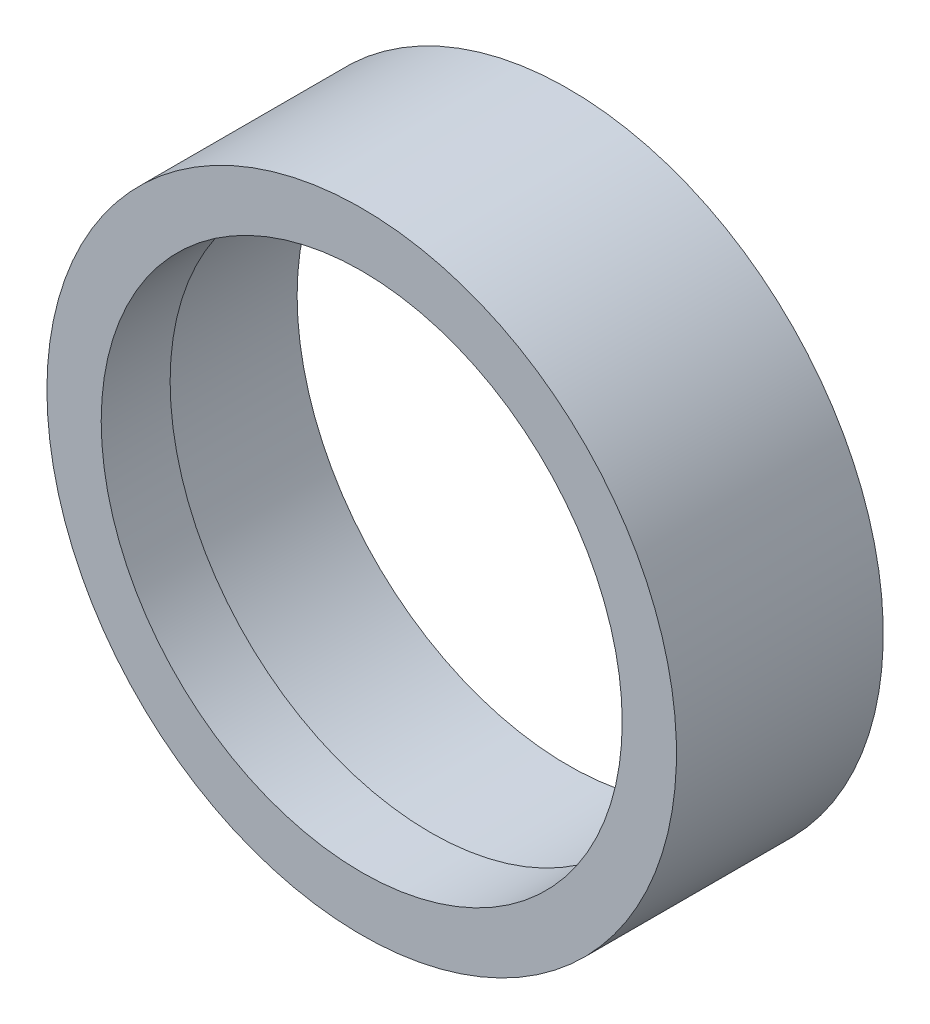
ISO-10303-21;
HEADER;
FILE_DESCRIPTION(('STEP AP214'),'2;1');
FILE_NAME('part.step','',(''),(''),'','','');
FILE_SCHEMA(('AUTOMOTIVE_DESIGN { 1 0 10303 214 1 1 1 1 }'));
ENDSEC;
DATA;
#1=APPLICATION_CONTEXT('core data for automotive mechanical design processes');
#2=APPLICATION_PROTOCOL_DEFINITION('international standard','automotive_design',2000,#1);
#3=PRODUCT_CONTEXT('',#1,'mechanical');
#4=PRODUCT('Part','Part','',(#3));
#5=PRODUCT_RELATED_PRODUCT_CATEGORY('part','',(#4));
#6=PRODUCT_DEFINITION_FORMATION('','',#4);
#7=PRODUCT_DEFINITION_CONTEXT('part definition',#1,'design');
#8=PRODUCT_DEFINITION('design','',#6,#7);
#9=PRODUCT_DEFINITION_SHAPE('','',#8);
#10=(LENGTH_UNIT() NAMED_UNIT(*) SI_UNIT(.MILLI.,.METRE.));
#11=(NAMED_UNIT(*) PLANE_ANGLE_UNIT() SI_UNIT($,.RADIAN.));
#12=(NAMED_UNIT(*) SI_UNIT($,.STERADIAN.) SOLID_ANGLE_UNIT());
#13=UNCERTAINTY_MEASURE_WITH_UNIT(LENGTH_MEASURE(1.E-05),#10,'distance_accuracy_value','');
#14=(GEOMETRIC_REPRESENTATION_CONTEXT(3) GLOBAL_UNCERTAINTY_ASSIGNED_CONTEXT((#13)) GLOBAL_UNIT_ASSIGNED_CONTEXT((#10,
#11,#12)) REPRESENTATION_CONTEXT('',''));
#15=CARTESIAN_POINT('',(0.,0.,0.));
#16=DIRECTION('',(0.,0.,1.));
#17=DIRECTION('',(1.,0.,0.));
#18=AXIS2_PLACEMENT_3D('',#15,#16,#17);
#19=CARTESIAN_POINT('',(0.,0.,19.05));
#20=DIRECTION('',(0.,0.,-1.));
#21=DIRECTION('',(-1.,0.,0.));
#22=AXIS2_PLACEMENT_3D('',#19,#20,#21);
#23=CYLINDRICAL_SURFACE('',#22,25.);
#24=CARTESIAN_POINT('',(0.,0.,0.));
#25=DIRECTION('',(0.,0.,1.));
#26=DIRECTION('',(1.,0.,0.));
#27=AXIS2_PLACEMENT_3D('',#24,#25,#26);
#28=CIRCLE('',#27,25.);
#29=CARTESIAN_POINT('',(-25.,0.,0.));
#30=VERTEX_POINT('',#29);
#31=EDGE_CURVE('E44',#30,#30,#28,.T.);
#32=CARTESIAN_POINT('',(0.,0.,12.7));
#33=DIRECTION('',(0.,0.,1.));
#34=DIRECTION('',(1.,0.,0.));
#35=AXIS2_PLACEMENT_3D('',#32,#33,#34);
#36=CIRCLE('',#35,25.);
#37=CARTESIAN_POINT('',(-25.,0.,12.7));
#38=VERTEX_POINT('',#37);
#39=EDGE_CURVE('E48',#38,#38,#36,.T.);
#40=CARTESIAN_POINT('',(-25.,0.,0.));
#41=CARTESIAN_POINT('',(-25.,0.,0.132291666666667));
#42=CARTESIAN_POINT('',(-25.,0.,0.264583333333334));
#43=CARTESIAN_POINT('',(-25.,0.,0.529166666666667));
#44=CARTESIAN_POINT('',(-25.,0.,0.661458333333333));
#45=CARTESIAN_POINT('',(-25.,0.,0.926041666666666));
#46=CARTESIAN_POINT('',(-25.,0.,1.05833333333333));
#47=CARTESIAN_POINT('',(-25.,0.,1.32291666666667));
#48=CARTESIAN_POINT('',(-25.,0.,1.45520833333333));
#49=CARTESIAN_POINT('',(-25.,0.,1.71979166666667));
#50=CARTESIAN_POINT('',(-25.,0.,1.85208333333333));
#51=CARTESIAN_POINT('',(-25.,0.,2.11666666666667));
#52=CARTESIAN_POINT('',(-25.,0.,2.24895833333333));
#53=CARTESIAN_POINT('',(-25.,0.,2.51354166666667));
#54=CARTESIAN_POINT('',(-25.,0.,2.64583333333333));
#55=CARTESIAN_POINT('',(-25.,0.,2.91041666666667));
#56=CARTESIAN_POINT('',(-25.,0.,3.04270833333333));
#57=CARTESIAN_POINT('',(-25.,0.,3.30729166666667));
#58=CARTESIAN_POINT('',(-25.,0.,3.43958333333333));
#59=CARTESIAN_POINT('',(-25.,0.,3.70416666666667));
#60=CARTESIAN_POINT('',(-25.,0.,3.83645833333333));
#61=CARTESIAN_POINT('',(-25.,0.,4.10104166666667));
#62=CARTESIAN_POINT('',(-25.,0.,4.23333333333333));
#63=CARTESIAN_POINT('',(-25.,0.,4.49791666666667));
#64=CARTESIAN_POINT('',(-25.,0.,4.63020833333333));
#65=CARTESIAN_POINT('',(-25.,0.,4.89479166666667));
#66=CARTESIAN_POINT('',(-25.,0.,5.02708333333333));
#67=CARTESIAN_POINT('',(-25.,0.,5.29166666666667));
#68=CARTESIAN_POINT('',(-25.,0.,5.42395833333333));
#69=CARTESIAN_POINT('',(-25.,0.,5.68854166666667));
#70=CARTESIAN_POINT('',(-25.,0.,5.82083333333333));
#71=CARTESIAN_POINT('',(-25.,0.,6.08541666666667));
#72=CARTESIAN_POINT('',(-25.,0.,6.21770833333333));
#73=CARTESIAN_POINT('',(-25.,0.,6.48229166666667));
#74=CARTESIAN_POINT('',(-25.,0.,6.61458333333333));
#75=CARTESIAN_POINT('',(-25.,0.,6.87916666666667));
#76=CARTESIAN_POINT('',(-25.,0.,7.01145833333333));
#77=CARTESIAN_POINT('',(-25.,0.,7.27604166666667));
#78=CARTESIAN_POINT('',(-25.,0.,7.40833333333333));
#79=CARTESIAN_POINT('',(-25.,0.,7.67291666666667));
#80=CARTESIAN_POINT('',(-25.,0.,7.80520833333333));
#81=CARTESIAN_POINT('',(-25.,0.,8.06979166666667));
#82=CARTESIAN_POINT('',(-25.,0.,8.20208333333333));
#83=CARTESIAN_POINT('',(-25.,0.,8.46666666666667));
#84=CARTESIAN_POINT('',(-25.,0.,8.59895833333333));
#85=CARTESIAN_POINT('',(-25.,0.,8.86354166666667));
#86=CARTESIAN_POINT('',(-25.,0.,8.99583333333334));
#87=CARTESIAN_POINT('',(-25.,0.,9.26041666666667));
#88=CARTESIAN_POINT('',(-25.,0.,9.39270833333333));
#89=CARTESIAN_POINT('',(-25.,0.,9.65729166666667));
#90=CARTESIAN_POINT('',(-25.,0.,9.78958333333333));
#91=CARTESIAN_POINT('',(-25.,0.,10.0541666666667));
#92=CARTESIAN_POINT('',(-25.,0.,10.1864583333333));
#93=CARTESIAN_POINT('',(-25.,0.,10.4510416666667));
#94=CARTESIAN_POINT('',(-25.,0.,10.5833333333333));
#95=CARTESIAN_POINT('',(-25.,0.,10.8479166666667));
#96=CARTESIAN_POINT('',(-25.,0.,10.9802083333333));
#97=CARTESIAN_POINT('',(-25.,0.,11.2447916666667));
#98=CARTESIAN_POINT('',(-25.,0.,11.3770833333333));
#99=CARTESIAN_POINT('',(-25.,0.,11.6416666666667));
#100=CARTESIAN_POINT('',(-25.,0.,11.7739583333333));
#101=CARTESIAN_POINT('',(-25.,0.,12.0385416666667));
#102=CARTESIAN_POINT('',(-25.,0.,12.1708333333333));
#103=CARTESIAN_POINT('',(-25.,0.,12.4354166666667));
#104=CARTESIAN_POINT('',(-25.,0.,12.5677083333333));
#105=CARTESIAN_POINT('',(-25.,0.,12.7));
#106=B_SPLINE_CURVE_WITH_KNOTS('',3,(#40,#41,#42,#43,#44,#45,#46,#47,#48,#49,#50,#51,#52,#53,
#54,#55,#56,#57,#58,#59,#60,#61,#62,#63,#64,#65,#66,#67,#68,#69,#70,#71,#72,#73,#74,#75,#76,#77,
#78,#79,#80,#81,#82,#83,#84,#85,#86,#87,#88,#89,#90,#91,#92,#93,#94,#95,#96,#97,#98,#99,#100,
#101,#102,#103,#104,#105),.UNSPECIFIED.,.F.,.F.,(4,2,2,2,2,2,2,2,2,2,2,2,2,2,2,2,2,2,2,2,2,2,2,
2,2,2,2,2,2,2,2,2,4),(0.,0.396875000000001,0.793749999999999,1.190625,1.5875,1.984375,2.38125,
2.778125,3.175,3.571875,3.96875,4.365625,4.7625,5.159375,5.55625,5.953125,6.35,6.746875,7.14375,
7.540625,7.9375,8.334375,8.73125,9.128125,9.525,9.921875,10.31875,10.715625,11.1125,11.509375,
11.90625,12.303125,12.7),.UNSPECIFIED.);
#107=EDGE_CURVE('BSEAM33',#30,#38,#106,.T.);
#108=ORIENTED_EDGE('',*,*,#31,.F.);
#109=ORIENTED_EDGE('',*,*,#39,.T.);
#110=ORIENTED_EDGE('',*,*,#107,.T.);
#111=ORIENTED_EDGE('',*,*,#107,.F.);
#112=EDGE_LOOP('',(#108,#110,#109,#111));
#113=FACE_BOUND('',#112,.T.);
#114=ADVANCED_FACE('F33',(#113),#23,.F.);
#115=CARTESIAN_POINT('',(0.,0.,19.05));
#116=DIRECTION('',(0.,0.,1.));
#117=DIRECTION('',(1.,0.,0.));
#118=AXIS2_PLACEMENT_3D('',#115,#116,#117);
#119=PLANE('',#118);
#120=CARTESIAN_POINT('',(0.,0.,19.05));
#121=DIRECTION('',(0.,0.,1.));
#122=DIRECTION('',(1.,0.,0.));
#123=AXIS2_PLACEMENT_3D('',#120,#121,#122);
#124=CIRCLE('',#123,29.);
#125=CARTESIAN_POINT('',(-29.,0.,19.05));
#126=VERTEX_POINT('',#125);
#127=EDGE_CURVE('E10',#126,#126,#124,.T.);
#128=ORIENTED_EDGE('',*,*,#127,.T.);
#129=EDGE_LOOP('',(#128));
#130=FACE_BOUND('',#129,.T.);
#131=CARTESIAN_POINT('',(0.,0.,19.05));
#132=DIRECTION('',(0.,0.,1.));
#133=DIRECTION('',(1.,0.,0.));
#134=AXIS2_PLACEMENT_3D('',#131,#132,#133);
#135=CIRCLE('',#134,24.);
#136=CARTESIAN_POINT('',(24.,0.,19.05));
#137=VERTEX_POINT('',#136);
#138=EDGE_CURVE('E52',#137,#137,#135,.T.);
#139=ORIENTED_EDGE('',*,*,#138,.F.);
#140=EDGE_LOOP('',(#139));
#141=FACE_BOUND('',#140,.T.);
#142=ADVANCED_FACE('F67',(#130,#141),#119,.T.);
#143=CARTESIAN_POINT('',(0.,0.,0.));
#144=DIRECTION('',(0.,0.,1.));
#145=DIRECTION('',(1.,0.,0.));
#146=AXIS2_PLACEMENT_3D('',#143,#144,#145);
#147=PLANE('',#146);
#148=CARTESIAN_POINT('',(0.,0.,0.));
#149=DIRECTION('',(0.,0.,1.));
#150=DIRECTION('',(1.,0.,0.));
#151=AXIS2_PLACEMENT_3D('',#148,#149,#150);
#152=CIRCLE('',#151,29.);
#153=CARTESIAN_POINT('',(-29.,0.,0.));
#154=VERTEX_POINT('',#153);
#155=EDGE_CURVE('E37',#154,#154,#152,.T.);
#156=ORIENTED_EDGE('',*,*,#155,.F.);
#157=EDGE_LOOP('',(#156));
#158=FACE_BOUND('',#157,.T.);
#159=ORIENTED_EDGE('',*,*,#31,.T.);
#160=EDGE_LOOP('',(#159));
#161=FACE_BOUND('',#160,.T.);
#162=ADVANCED_FACE('F69',(#158,#161),#147,.F.);
#163=CARTESIAN_POINT('',(0.,0.,19.05));
#164=DIRECTION('',(0.,0.,-1.));
#165=DIRECTION('',(-1.,0.,0.));
#166=AXIS2_PLACEMENT_3D('',#163,#164,#165);
#167=CYLINDRICAL_SURFACE('',#166,29.);
#168=CARTESIAN_POINT('',(-29.,0.,19.05));
#169=CARTESIAN_POINT('',(-29.,0.,18.8515625));
#170=CARTESIAN_POINT('',(-29.,0.,18.653125));
#171=CARTESIAN_POINT('',(-29.,0.,18.25625));
#172=CARTESIAN_POINT('',(-29.,0.,18.0578125));
#173=CARTESIAN_POINT('',(-29.,0.,17.6609375));
#174=CARTESIAN_POINT('',(-29.,0.,17.4625));
#175=CARTESIAN_POINT('',(-29.,0.,17.065625));
#176=CARTESIAN_POINT('',(-29.,0.,16.8671875));
#177=CARTESIAN_POINT('',(-29.,0.,16.4703125));
#178=CARTESIAN_POINT('',(-29.,0.,16.271875));
#179=CARTESIAN_POINT('',(-29.,0.,15.875));
#180=CARTESIAN_POINT('',(-29.,0.,15.6765625));
#181=CARTESIAN_POINT('',(-29.,0.,15.2796875));
#182=CARTESIAN_POINT('',(-29.,0.,15.08125));
#183=CARTESIAN_POINT('',(-29.,0.,14.684375));
#184=CARTESIAN_POINT('',(-29.,0.,14.4859375));
#185=CARTESIAN_POINT('',(-29.,0.,14.0890625));
#186=CARTESIAN_POINT('',(-29.,0.,13.890625));
#187=CARTESIAN_POINT('',(-29.,0.,13.49375));
#188=CARTESIAN_POINT('',(-29.,0.,13.2953125));
#189=CARTESIAN_POINT('',(-29.,0.,12.8984375));
#190=CARTESIAN_POINT('',(-29.,0.,12.7));
#191=CARTESIAN_POINT('',(-29.,0.,12.303125));
#192=CARTESIAN_POINT('',(-29.,0.,12.1046875));
#193=CARTESIAN_POINT('',(-29.,0.,11.7078125));
#194=CARTESIAN_POINT('',(-29.,0.,11.509375));
#195=CARTESIAN_POINT('',(-29.,0.,11.1125));
#196=CARTESIAN_POINT('',(-29.,0.,10.9140625));
#197=CARTESIAN_POINT('',(-29.,0.,10.5171875));
#198=CARTESIAN_POINT('',(-29.,0.,10.31875));
#199=CARTESIAN_POINT('',(-29.,0.,9.921875));
#200=CARTESIAN_POINT('',(-29.,0.,9.7234375));
#201=CARTESIAN_POINT('',(-29.,0.,9.3265625));
#202=CARTESIAN_POINT('',(-29.,0.,9.128125));
#203=CARTESIAN_POINT('',(-29.,0.,8.73125));
#204=CARTESIAN_POINT('',(-29.,0.,8.5328125));
#205=CARTESIAN_POINT('',(-29.,0.,8.1359375));
#206=CARTESIAN_POINT('',(-29.,0.,7.9375));
#207=CARTESIAN_POINT('',(-29.,0.,7.540625));
#208=CARTESIAN_POINT('',(-29.,0.,7.3421875));
#209=CARTESIAN_POINT('',(-29.,0.,6.9453125));
#210=CARTESIAN_POINT('',(-29.,0.,6.746875));
#211=CARTESIAN_POINT('',(-29.,0.,6.35));
#212=CARTESIAN_POINT('',(-29.,0.,6.1515625));
#213=CARTESIAN_POINT('',(-29.,0.,5.7546875));
#214=CARTESIAN_POINT('',(-29.,0.,5.55625));
#215=CARTESIAN_POINT('',(-29.,0.,5.159375));
#216=CARTESIAN_POINT('',(-29.,0.,4.9609375));
#217=CARTESIAN_POINT('',(-29.,0.,4.5640625));
#218=CARTESIAN_POINT('',(-29.,0.,4.365625));
#219=CARTESIAN_POINT('',(-29.,0.,3.96875));
#220=CARTESIAN_POINT('',(-29.,0.,3.7703125));
#221=CARTESIAN_POINT('',(-29.,0.,3.3734375));
#222=CARTESIAN_POINT('',(-29.,0.,3.175));
#223=CARTESIAN_POINT('',(-29.,0.,2.778125));
#224=CARTESIAN_POINT('',(-29.,0.,2.5796875));
#225=CARTESIAN_POINT('',(-29.,0.,2.1828125));
#226=CARTESIAN_POINT('',(-29.,0.,1.984375));
#227=CARTESIAN_POINT('',(-29.,0.,1.5875));
#228=CARTESIAN_POINT('',(-29.,0.,1.3890625));
#229=CARTESIAN_POINT('',(-29.,0.,0.992187500000001));
#230=CARTESIAN_POINT('',(-29.,0.,0.793750000000001));
#231=CARTESIAN_POINT('',(-29.,0.,0.396875));
#232=CARTESIAN_POINT('',(-29.,0.,0.1984375));
#233=CARTESIAN_POINT('',(-29.,0.,0.));
#234=B_SPLINE_CURVE_WITH_KNOTS('',3,(#168,#169,#170,#171,#172,#173,#174,#175,#176,#177,#178,
#179,#180,#181,#182,#183,#184,#185,#186,#187,#188,#189,#190,#191,#192,#193,#194,#195,#196,#197,
#198,#199,#200,#201,#202,#203,#204,#205,#206,#207,#208,#209,#210,#211,#212,#213,#214,#215,#216,
#217,#218,#219,#220,#221,#222,#223,#224,#225,#226,#227,#228,#229,#230,#231,#232,#233),
.UNSPECIFIED.,.F.,.F.,(4,2,2,2,2,2,2,2,2,2,2,2,2,2,2,2,2,2,2,2,2,2,2,2,2,2,2,2,2,2,2,2,4),(0.,
0.595312499999997,1.190625,1.7859375,2.38125,2.9765625,3.571875,4.1671875,4.7625,5.3578125,
5.953125,6.5484375,7.14375,7.7390625,8.334375,8.9296875,9.525,10.1203125,10.715625,11.3109375,
11.90625,12.5015625,13.096875,13.6921875,14.2875,14.8828125,15.478125,16.0734375,16.66875,
17.2640625,17.859375,18.4546875,19.05),.UNSPECIFIED.);
#235=EDGE_CURVE('BSEAM35',#126,#154,#234,.T.);
#236=ORIENTED_EDGE('',*,*,#127,.F.);
#237=ORIENTED_EDGE('',*,*,#155,.T.);
#238=ORIENTED_EDGE('',*,*,#235,.T.);
#239=ORIENTED_EDGE('',*,*,#235,.F.);
#240=EDGE_LOOP('',(#236,#238,#237,#239));
#241=FACE_BOUND('',#240,.T.);
#242=ADVANCED_FACE('F35',(#241),#167,.T.);
#243=CARTESIAN_POINT('',(0.,0.,12.7));
#244=DIRECTION('',(0.,0.,1.));
#245=DIRECTION('',(1.,0.,0.));
#246=AXIS2_PLACEMENT_3D('',#243,#244,#245);
#247=PLANE('',#246);
#248=CARTESIAN_POINT('',(0.,0.,12.7));
#249=DIRECTION('',(0.,0.,1.));
#250=DIRECTION('',(1.,0.,0.));
#251=AXIS2_PLACEMENT_3D('',#248,#249,#250);
#252=CIRCLE('',#251,24.);
#253=CARTESIAN_POINT('',(24.,0.,12.7));
#254=VERTEX_POINT('',#253);
#255=EDGE_CURVE('E51',#254,#254,#252,.T.);
#256=ORIENTED_EDGE('',*,*,#255,.T.);
#257=EDGE_LOOP('',(#256));
#258=FACE_BOUND('',#257,.T.);
#259=ORIENTED_EDGE('',*,*,#39,.F.);
#260=EDGE_LOOP('',(#259));
#261=FACE_BOUND('',#260,.T.);
#262=ADVANCED_FACE('F58',(#258,#261),#247,.F.);
#263=CARTESIAN_POINT('',(0.,0.,12.7));
#264=DIRECTION('',(0.,0.,1.));
#265=DIRECTION('',(1.,0.,0.));
#266=AXIS2_PLACEMENT_3D('',#263,#264,#265);
#267=CYLINDRICAL_SURFACE('',#266,24.);
#268=ORIENTED_EDGE('',*,*,#255,.F.);
#269=EDGE_LOOP('',(#268));
#270=FACE_BOUND('',#269,.T.);
#271=ORIENTED_EDGE('',*,*,#138,.T.);
#272=EDGE_LOOP('',(#271));
#273=FACE_BOUND('',#272,.T.);
#274=ADVANCED_FACE('F61',(#270,#273),#267,.F.);
#275=CLOSED_SHELL('',(#114,#142,#162,#242,#262,#274));
#276=MANIFOLD_SOLID_BREP('B2',#275);
#277=ADVANCED_BREP_SHAPE_REPRESENTATION('',(#18,#276),#14);
#278=SHAPE_DEFINITION_REPRESENTATION(#9,#277);
ENDSEC;
END-ISO-10303-21;
